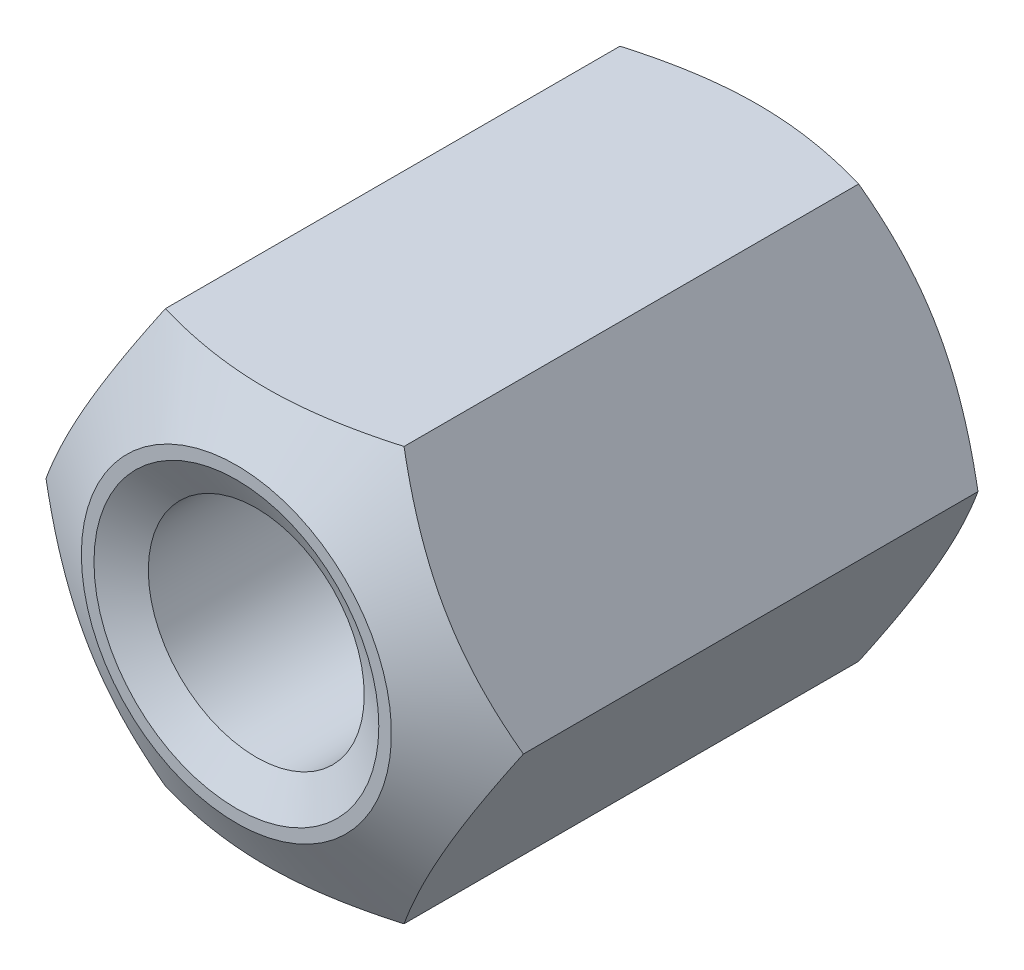
ISO-10303-21;
HEADER;
FILE_DESCRIPTION(('STEP AP214'),'2;1');
FILE_NAME('part.step','',(''),(''),'','','');
FILE_SCHEMA(('AUTOMOTIVE_DESIGN { 1 0 10303 214 1 1 1 1 }'));
ENDSEC;
DATA;
#1=APPLICATION_CONTEXT('core data for automotive mechanical design processes');
#2=APPLICATION_PROTOCOL_DEFINITION('international standard','automotive_design',2000,#1);
#3=PRODUCT_CONTEXT('',#1,'mechanical');
#4=PRODUCT('Part','Part','',(#3));
#5=PRODUCT_RELATED_PRODUCT_CATEGORY('part','',(#4));
#6=PRODUCT_DEFINITION_FORMATION('','',#4);
#7=PRODUCT_DEFINITION_CONTEXT('part definition',#1,'design');
#8=PRODUCT_DEFINITION('design','',#6,#7);
#9=PRODUCT_DEFINITION_SHAPE('','',#8);
#10=(LENGTH_UNIT() NAMED_UNIT(*) SI_UNIT(.MILLI.,.METRE.));
#11=(NAMED_UNIT(*) PLANE_ANGLE_UNIT() SI_UNIT($,.RADIAN.));
#12=(NAMED_UNIT(*) SI_UNIT($,.STERADIAN.) SOLID_ANGLE_UNIT());
#13=UNCERTAINTY_MEASURE_WITH_UNIT(LENGTH_MEASURE(1.E-05),#10,'distance_accuracy_value','');
#14=(GEOMETRIC_REPRESENTATION_CONTEXT(3) GLOBAL_UNCERTAINTY_ASSIGNED_CONTEXT((#13)) GLOBAL_UNIT_ASSIGNED_CONTEXT((#10,
#11,#12)) REPRESENTATION_CONTEXT('',''));
#15=CARTESIAN_POINT('',(0.,0.,0.));
#16=DIRECTION('',(0.,0.,1.));
#17=DIRECTION('',(1.,0.,0.));
#18=AXIS2_PLACEMENT_3D('',#15,#16,#17);
#19=CARTESIAN_POINT('',(-0.866025403784436,-1.5,-4.));
#20=DIRECTION('',(0.,-1.,0.));
#21=DIRECTION('',(0.,0.,-1.));
#22=AXIS2_PLACEMENT_3D('',#19,#20,#21);
#23=PLANE('',#22);
#24=CARTESIAN_POINT('',(-2.26693345301521,-1.5,-0.919874384172642));
#25=CARTESIAN_POINT('',(-2.20188303273797,-1.5,-0.888562452462311));
#26=CARTESIAN_POINT('',(-2.13667684988253,-1.5,-0.857568569031008));
#27=CARTESIAN_POINT('',(-2.00586953022165,-1.5,-0.7963969093381));
#28=CARTESIAN_POINT('',(-1.94026832716272,-1.5,-0.766219274919815));
#29=CARTESIAN_POINT('',(-1.80822017956272,-1.5,-0.706695365326242));
#30=CARTESIAN_POINT('',(-1.74177052725006,-1.5,-0.677355070587742));
#31=CARTESIAN_POINT('',(-1.60832240242563,-1.5,-0.619958278975157));
#32=CARTESIAN_POINT('',(-1.54132395796637,-1.5,-0.591901716957623));
#33=CARTESIAN_POINT('',(-1.40476495340522,-1.5,-0.536640444134464));
#34=CARTESIAN_POINT('',(-1.33518540573023,-1.5,-0.509482035692131));
#35=CARTESIAN_POINT('',(-1.19520545200329,-1.5,-0.457377612613115));
#36=CARTESIAN_POINT('',(-1.1248049448955,-1.5,-0.432431873667728));
#37=CARTESIAN_POINT('',(-0.912475099879092,-1.5,-0.361941641392045));
#38=CARTESIAN_POINT('',(-0.769037948715545,-1.5,-0.32058351367642));
#39=CARTESIAN_POINT('',(-0.55117522790169,-1.5,-0.272320238838825));
#40=CARTESIAN_POINT('',(-0.478279688505808,-1.5,-0.258544668352086));
#41=CARTESIAN_POINT('',(-0.331643668736196,-1.5,-0.236479268966357));
#42=CARTESIAN_POINT('',(-0.257903250213881,-1.5,-0.228189041077221));
#43=CARTESIAN_POINT('',(-0.110885806995904,-1.5,-0.217861610132535));
#44=CARTESIAN_POINT('',(-0.0376142381396591,-1.5,-0.215748751807276));
#45=CARTESIAN_POINT('',(0.108840678925693,-1.5,-0.217752050691236));
#46=CARTESIAN_POINT('',(0.182024023057309,-1.5,-0.221868485528129));
#47=CARTESIAN_POINT('',(0.361283721333757,-1.5,-0.239217704292242));
#48=CARTESIAN_POINT('',(0.467039999376319,-1.5,-0.255767579870401));
#49=CARTESIAN_POINT('',(0.676513016249369,-1.5,-0.298813596634206));
#50=CARTESIAN_POINT('',(0.78022748407577,-1.5,-0.325320219634023));
#51=CARTESIAN_POINT('',(0.987747554950468,-1.5,-0.386092023869418));
#52=CARTESIAN_POINT('',(1.09150632260099,-1.5,-0.420513046538082));
#53=CARTESIAN_POINT('',(1.29711320820291,-1.5,-0.494457523924006));
#54=CARTESIAN_POINT('',(1.39896195446643,-1.5,-0.533979265773226));
#55=CARTESIAN_POINT('',(1.63268883721878,-1.5,-0.629393113847812));
#56=CARTESIAN_POINT('',(1.76404499844625,-1.5,-0.686551305017162));
#57=CARTESIAN_POINT('',(2.02503341818732,-1.5,-0.804698224256575));
#58=CARTESIAN_POINT('',(2.15466528292228,-1.5,-0.865687809704643));
#59=CARTESIAN_POINT('',(2.41281157832431,-1.5,-0.990261928905305));
#60=CARTESIAN_POINT('',(2.54132491927922,-1.5,-1.05384871003748));
#61=CARTESIAN_POINT('',(2.7974698083102,-1.5,-1.18277574092178));
#62=CARTESIAN_POINT('',(2.92510133041389,-1.5,-1.24811604204618));
#63=CARTESIAN_POINT('',(3.16960929365729,-1.5,-1.37481289046744));
#64=CARTESIAN_POINT('',(3.28653531165753,-1.5,-1.43607399275226));
#65=CARTESIAN_POINT('',(3.51996707335722,-1.5,-1.55939892213538));
#66=CARTESIAN_POINT('',(3.63647280463813,-1.5,-1.62146277270864));
#67=CARTESIAN_POINT('',(3.86890456937834,-1.5,-1.7460713661942));
#68=CARTESIAN_POINT('',(3.98483131033979,-1.5,-1.8086147911346));
#69=CARTESIAN_POINT('',(4.21641481057912,-1.5,-1.93418664618929));
#70=CARTESIAN_POINT('',(4.33207158240369,-1.5,-1.99721505315485));
#71=CARTESIAN_POINT('',(4.44762816953721,-1.5,-2.06042537060534));
#72=B_SPLINE_CURVE_WITH_KNOTS('',3,(#24,#25,#26,#27,#28,#29,#30,#31,#32,#33,#34,#35,#36,#37,#38,
#39,#40,#41,#42,#43,#44,#45,#46,#47,#48,#49,#50,#51,#52,#53,#54,#55,#56,#57,#58,#59,#60,#61,#62,
#63,#64,#65,#66,#67,#68,#69,#70,#71),.UNSPECIFIED.,.F.,.F.,(4,2,2,2,2,2,2,2,2,2,2,2,2,2,2,2,2,2,
2,2,2,2,2,4),(0.,0.216585078480729,0.433207555234763,0.651112650745326,0.86900667629712,
1.09304248962346,1.31710617797398,1.7639991691894,1.98639046187009,2.20876557658381,
2.42840557690672,2.64805536645234,2.96852202366,3.2893269970795,3.61709161422759,
3.9447464500269,4.37440217676969,4.80415439546756,5.23428670622766,5.6644316322128,
6.0604347438135,6.45644946212125,6.85161425159961,7.24676029499814),.UNSPECIFIED.);
#73=CARTESIAN_POINT('',(-0.866025403784437,-1.5,-0.350480947161665));
#74=VERTEX_POINT('',#73);
#75=CARTESIAN_POINT('',(0.866025403784439,-1.5,-0.350480947161665));
#76=VERTEX_POINT('',#75);
#77=EDGE_CURVE('E49',#74,#76,#72,.T.);
#78=ORIENTED_EDGE('',*,*,#77,.F.);
#79=DIRECTION('',(0.,0.,1.));
#80=VECTOR('',#79,1.);
#81=CARTESIAN_POINT('',(-0.866025403784436,-1.5,-4.));
#82=LINE('',#81,#80);
#83=CARTESIAN_POINT('',(-0.866025403784436,-1.5,-3.64951905283833));
#84=VERTEX_POINT('',#83);
#85=EDGE_CURVE('E104',#84,#74,#82,.T.);
#86=ORIENTED_EDGE('',*,*,#85,.F.);
#87=CARTESIAN_POINT('',(-2.26693345301521,-1.5,-3.08012561582736));
#88=CARTESIAN_POINT('',(-2.20188303273797,-1.5,-3.11143754753769));
#89=CARTESIAN_POINT('',(-2.13667684988253,-1.5,-3.14243143096899));
#90=CARTESIAN_POINT('',(-2.00586953022165,-1.5,-3.2036030906619));
#91=CARTESIAN_POINT('',(-1.94026832716272,-1.5,-3.23378072508018));
#92=CARTESIAN_POINT('',(-1.80822017956272,-1.5,-3.29330463467376));
#93=CARTESIAN_POINT('',(-1.74177052725006,-1.5,-3.32264492941226));
#94=CARTESIAN_POINT('',(-1.60832240242563,-1.5,-3.38004172102484));
#95=CARTESIAN_POINT('',(-1.54132395796637,-1.5,-3.40809828304238));
#96=CARTESIAN_POINT('',(-1.40476495340522,-1.5,-3.46335955586554));
#97=CARTESIAN_POINT('',(-1.33518540573023,-1.5,-3.49051796430787));
#98=CARTESIAN_POINT('',(-1.19520545200329,-1.5,-3.54262238738688));
#99=CARTESIAN_POINT('',(-1.1248049448955,-1.5,-3.56756812633227));
#100=CARTESIAN_POINT('',(-0.912475099879092,-1.5,-3.63805835860795));
#101=CARTESIAN_POINT('',(-0.769037948715546,-1.5,-3.67941648632358));
#102=CARTESIAN_POINT('',(-0.55117522790169,-1.5,-3.72767976116117));
#103=CARTESIAN_POINT('',(-0.478279688505808,-1.5,-3.74145533164791));
#104=CARTESIAN_POINT('',(-0.331643668736196,-1.5,-3.76352073103364));
#105=CARTESIAN_POINT('',(-0.257903250213881,-1.5,-3.77181095892278));
#106=CARTESIAN_POINT('',(-0.110885806995904,-1.5,-3.78213838986746));
#107=CARTESIAN_POINT('',(-0.0376142381396587,-1.5,-3.78425124819272));
#108=CARTESIAN_POINT('',(0.108840678925693,-1.5,-3.78224794930876));
#109=CARTESIAN_POINT('',(0.18202402305731,-1.5,-3.77813151447187));
#110=CARTESIAN_POINT('',(0.361283721333757,-1.5,-3.76078229570776));
#111=CARTESIAN_POINT('',(0.467039999376319,-1.5,-3.7442324201296));
#112=CARTESIAN_POINT('',(0.676513016249368,-1.5,-3.70118640336579));
#113=CARTESIAN_POINT('',(0.780227484075769,-1.5,-3.67467978036598));
#114=CARTESIAN_POINT('',(0.987747554950466,-1.5,-3.61390797613058));
#115=CARTESIAN_POINT('',(1.09150632260098,-1.5,-3.57948695346192));
#116=CARTESIAN_POINT('',(1.29711320820291,-1.5,-3.50554247607599));
#117=CARTESIAN_POINT('',(1.39896195446643,-1.5,-3.46602073422677));
#118=CARTESIAN_POINT('',(1.63268883721878,-1.5,-3.37060688615219));
#119=CARTESIAN_POINT('',(1.76404499844625,-1.5,-3.31344869498284));
#120=CARTESIAN_POINT('',(2.02503341818732,-1.5,-3.19530177574342));
#121=CARTESIAN_POINT('',(2.15466528292228,-1.5,-3.13431219029536));
#122=CARTESIAN_POINT('',(2.4128115783243,-1.5,-3.00973807109469));
#123=CARTESIAN_POINT('',(2.54132491927921,-1.5,-2.94615128996252));
#124=CARTESIAN_POINT('',(2.7974698083102,-1.5,-2.81722425907822));
#125=CARTESIAN_POINT('',(2.92510133041389,-1.5,-2.75188395795381));
#126=CARTESIAN_POINT('',(3.16960929365729,-1.5,-2.62518710953255));
#127=CARTESIAN_POINT('',(3.28653531165753,-1.5,-2.56392600724774));
#128=CARTESIAN_POINT('',(3.51996707335722,-1.5,-2.44060107786461));
#129=CARTESIAN_POINT('',(3.63647280463813,-1.5,-2.37853722729136));
#130=CARTESIAN_POINT('',(3.86890456937834,-1.5,-2.25392863380579));
#131=CARTESIAN_POINT('',(3.98483131033979,-1.5,-2.1913852088654));
#132=CARTESIAN_POINT('',(4.21641481057912,-1.5,-2.06581335381071));
#133=CARTESIAN_POINT('',(4.33207158240368,-1.5,-2.00278494684515));
#134=CARTESIAN_POINT('',(4.44762816953721,-1.5,-1.93957462939465));
#135=B_SPLINE_CURVE_WITH_KNOTS('',3,(#87,#88,#89,#90,#91,#92,#93,#94,#95,#96,#97,#98,#99,#100,
#101,#102,#103,#104,#105,#106,#107,#108,#109,#110,#111,#112,#113,#114,#115,#116,#117,#118,#119,
#120,#121,#122,#123,#124,#125,#126,#127,#128,#129,#130,#131,#132,#133,#134),.UNSPECIFIED.,.F.,
.F.,(4,2,2,2,2,2,2,2,2,2,2,2,2,2,2,2,2,2,2,2,2,2,2,4),(0.,0.216585078480729,0.433207555234763,
0.651112650745326,0.86900667629712,1.09304248962346,1.31710617797398,1.7639991691894,
1.98639046187009,2.20876557658381,2.42840557690672,2.64805536645234,2.96852202366,
3.2893269970795,3.61709161422759,3.94474645002689,4.37440217676969,4.80415439546756,
5.23428670622766,5.6644316322128,6.0604347438135,6.45644946212125,6.85161425159961,
7.24676029499814),.UNSPECIFIED.);
#136=CARTESIAN_POINT('',(0.86602540378444,-1.5,-3.64951905283833));
#137=VERTEX_POINT('',#136);
#138=EDGE_CURVE('E125',#137,#84,#135,.F.);
#139=ORIENTED_EDGE('',*,*,#138,.F.);
#140=DIRECTION('',(0.,0.,1.));
#141=VECTOR('',#140,1.);
#142=CARTESIAN_POINT('',(0.866025403784439,-1.5,-4.));
#143=LINE('',#142,#141);
#144=EDGE_CURVE('E122',#137,#76,#143,.T.);
#145=ORIENTED_EDGE('',*,*,#144,.T.);
#146=EDGE_LOOP('',(#78,#86,#139,#145));
#147=FACE_BOUND('',#146,.T.);
#148=ADVANCED_FACE('F34',(#147),#23,.T.);
#149=CARTESIAN_POINT('',(-1.73205080756888,0.,-4.));
#150=DIRECTION('',(-0.866025403784438,-0.5,0.));
#151=DIRECTION('',(0.5,-0.866025403784438,0.));
#152=AXIS2_PLACEMENT_3D('',#149,#150,#151);
#153=PLANE('',#152);
#154=CARTESIAN_POINT('',(-1.73216627762271,0.000199999999999783,-0.350547620494554));
#155=CARTESIAN_POINT('',(-1.69410775715987,-0.0657192911025477,-0.328563803715282));
#156=CARTESIAN_POINT('',(-1.65572072040024,-0.132207589122235,-0.308569836627927));
#157=CARTESIAN_POINT('',(-1.5782818421891,-0.26633566066507,-0.273669048130612));
#158=CARTESIAN_POINT('',(-1.53922862406973,-0.333977818646886,-0.258774575269272));
#159=CARTESIAN_POINT('',(-1.4616062133209,-0.468423777869842,-0.235587628256349));
#160=CARTESIAN_POINT('',(-1.42304896848399,-0.535206884927247,-0.22714085865792));
#161=CARTESIAN_POINT('',(-1.34575291984755,-0.669087568389879,-0.217054524457959));
#162=CARTESIAN_POINT('',(-1.30701439726998,-0.736184657704377,-0.215406610303996));
#163=CARTESIAN_POINT('',(-1.23462040422031,-0.861574731829194,-0.21882256999921));
#164=CARTESIAN_POINT('',(-1.20095413349903,-0.919886423219818,-0.223047706170086));
#165=CARTESIAN_POINT('',(-1.13384094270175,-1.03612987953878,-0.236442722378777));
#166=CARTESIAN_POINT('',(-1.10039425500826,-1.09406124196878,-0.245617184561953));
#167=CARTESIAN_POINT('',(-1.03314252725215,-1.21054465133915,-0.2685541309011));
#168=CARTESIAN_POINT('',(-0.999346005261149,-1.26908194454669,-0.282413909107551));
#169=CARTESIAN_POINT('',(-0.932257223377915,-1.38528312338636,-0.31387073118276));
#170=CARTESIAN_POINT('',(-0.898964103011319,-1.44294849940381,-0.331460376835719));
#171=CARTESIAN_POINT('',(-0.865909933730598,-1.5002,-0.350547620494554));
#172=B_SPLINE_CURVE_WITH_KNOTS('',3,(#154,#155,#156,#157,#158,#159,#160,#161,#162,#163,#164,
#165,#166,#167,#168,#169,#170,#171),.UNSPECIFIED.,.F.,.F.,(4,2,2,2,2,2,2,2,4),(0.,
0.237777822177383,0.476127422841918,0.708577067230589,0.940741159251578,1.1429435283589,
1.34533342091875,1.55221450553907,1.75868901573748),.UNSPECIFIED.);
#173=CARTESIAN_POINT('',(-1.73205080756888,0.,-0.350480947161665));
#174=VERTEX_POINT('',#173);
#175=EDGE_CURVE('E89',#174,#74,#172,.T.);
#176=ORIENTED_EDGE('',*,*,#175,.F.);
#177=DIRECTION('',(0.,0.,1.));
#178=VECTOR('',#177,1.);
#179=CARTESIAN_POINT('',(-1.73205080756888,0.,-4.));
#180=LINE('',#179,#178);
#181=CARTESIAN_POINT('',(-1.73205080756888,0.,-3.64951905283833));
#182=VERTEX_POINT('',#181);
#183=EDGE_CURVE('E102',#182,#174,#180,.T.);
#184=ORIENTED_EDGE('',*,*,#183,.F.);
#185=CARTESIAN_POINT('',(-0.865909933730598,-1.5002,-3.64945237950545));
#186=CARTESIAN_POINT('',(-0.903968454193444,-1.43428070889745,-3.67143619628472));
#187=CARTESIAN_POINT('',(-0.94235549095307,-1.36779241087777,-3.69143016337207));
#188=CARTESIAN_POINT('',(-1.01979436916421,-1.23366433933493,-3.72633095186939));
#189=CARTESIAN_POINT('',(-1.05884758728358,-1.16602218135312,-3.74122542473073));
#190=CARTESIAN_POINT('',(-1.13646999803241,-1.03157622213016,-3.76441237174365));
#191=CARTESIAN_POINT('',(-1.17502724286932,-0.964793115072754,-3.77285914134208));
#192=CARTESIAN_POINT('',(-1.25232329150577,-0.830912431610121,-3.78294547554204));
#193=CARTESIAN_POINT('',(-1.29106181408333,-0.763815342295623,-3.784593389696));
#194=CARTESIAN_POINT('',(-1.363455807133,-0.638425268170806,-3.78117743000079));
#195=CARTESIAN_POINT('',(-1.39712207785428,-0.580113576780182,-3.77695229382991));
#196=CARTESIAN_POINT('',(-1.46423526865157,-0.463870120461219,-3.76355727762122));
#197=CARTESIAN_POINT('',(-1.49768195634505,-0.405938758031215,-3.75438281543805));
#198=CARTESIAN_POINT('',(-1.56493368410116,-0.289455348660849,-3.7314458690989));
#199=CARTESIAN_POINT('',(-1.59873020609216,-0.230918055453309,-3.71758609089245));
#200=CARTESIAN_POINT('',(-1.6658189879754,-0.114716876613641,-3.68612926881724));
#201=CARTESIAN_POINT('',(-1.69911210834199,-0.0570515005961898,-3.66853962316428));
#202=CARTESIAN_POINT('',(-1.73216627762271,0.000199999999999768,-3.64945237950545));
#203=B_SPLINE_CURVE_WITH_KNOTS('',3,(#185,#186,#187,#188,#189,#190,#191,#192,#193,#194,#195,
#196,#197,#198,#199,#200,#201,#202),.UNSPECIFIED.,.F.,.F.,(4,2,2,2,2,2,2,2,4),(0.,
0.237777822177383,0.476127422841918,0.708577067230588,0.940741159251578,1.1429435283589,
1.34533342091875,1.55221450553907,1.75868901573748),.UNSPECIFIED.);
#204=EDGE_CURVE('E198',#84,#182,#203,.T.);
#205=ORIENTED_EDGE('',*,*,#204,.F.);
#206=ORIENTED_EDGE('',*,*,#85,.T.);
#207=EDGE_LOOP('',(#176,#184,#205,#206));
#208=FACE_BOUND('',#207,.T.);
#209=ADVANCED_FACE('F100',(#208),#153,.T.);
#210=CARTESIAN_POINT('',(-0.866025403784437,1.5,-4.));
#211=DIRECTION('',(-0.866025403784439,0.5,0.));
#212=DIRECTION('',(-0.5,-0.866025403784439,0.));
#213=AXIS2_PLACEMENT_3D('',#210,#211,#212);
#214=PLANE('',#213);
#215=CARTESIAN_POINT('',(-0.865909933730599,1.5002,-0.350547620494554));
#216=CARTESIAN_POINT('',(-0.903968454193444,1.43428070889745,-0.328563803715282));
#217=CARTESIAN_POINT('',(-0.942355490953071,1.36779241087777,-0.308569836627927));
#218=CARTESIAN_POINT('',(-1.01979436916421,1.23366433933493,-0.273669048130612));
#219=CARTESIAN_POINT('',(-1.05884758728358,1.16602218135311,-0.258774575269272));
#220=CARTESIAN_POINT('',(-1.13646999803241,1.03157622213016,-0.235587628256349));
#221=CARTESIAN_POINT('',(-1.17502724286932,0.964793115072754,-0.22714085865792));
#222=CARTESIAN_POINT('',(-1.25232329150577,0.830912431610121,-0.217054524457959));
#223=CARTESIAN_POINT('',(-1.29106181408333,0.763815342295623,-0.215406610303997));
#224=CARTESIAN_POINT('',(-1.363455807133,0.638425268170806,-0.21882256999921));
#225=CARTESIAN_POINT('',(-1.39712207785428,0.580113576780182,-0.223047706170086));
#226=CARTESIAN_POINT('',(-1.46423526865157,0.463870120461218,-0.236442722378776));
#227=CARTESIAN_POINT('',(-1.49768195634505,0.405938758031215,-0.245617184561953));
#228=CARTESIAN_POINT('',(-1.56493368410116,0.289455348660848,-0.268554130901099));
#229=CARTESIAN_POINT('',(-1.59873020609216,0.230918055453308,-0.282413909107551));
#230=CARTESIAN_POINT('',(-1.6658189879754,0.11471687661364,-0.31387073118276));
#231=CARTESIAN_POINT('',(-1.69911210834199,0.0570515005961893,-0.331460376835719));
#232=CARTESIAN_POINT('',(-1.73216627762271,-0.000200000000000195,-0.350547620494554));
#233=B_SPLINE_CURVE_WITH_KNOTS('',3,(#215,#216,#217,#218,#219,#220,#221,#222,#223,#224,#225,
#226,#227,#228,#229,#230,#231,#232),.UNSPECIFIED.,.F.,.F.,(4,2,2,2,2,2,2,2,4),(0.,
0.237777822177383,0.476127422841918,0.708577067230588,0.940741159251578,1.1429435283589,
1.34533342091875,1.55221450553907,1.75868901573748),.UNSPECIFIED.);
#234=CARTESIAN_POINT('',(-0.866025403784436,1.5,-0.350480947161665));
#235=VERTEX_POINT('',#234);
#236=EDGE_CURVE('E85',#235,#174,#233,.T.);
#237=ORIENTED_EDGE('',*,*,#236,.F.);
#238=DIRECTION('',(0.,0.,1.));
#239=VECTOR('',#238,1.);
#240=CARTESIAN_POINT('',(-0.866025403784437,1.5,-4.));
#241=LINE('',#240,#239);
#242=CARTESIAN_POINT('',(-0.866025403784437,1.5,-3.64951905283833));
#243=VERTEX_POINT('',#242);
#244=EDGE_CURVE('E109',#243,#235,#241,.T.);
#245=ORIENTED_EDGE('',*,*,#244,.F.);
#246=CARTESIAN_POINT('',(-1.73216627762271,-0.000200000000000183,-3.64945237950545));
#247=CARTESIAN_POINT('',(-1.69410775715987,0.0657192911025475,-3.67143619628472));
#248=CARTESIAN_POINT('',(-1.65572072040024,0.132207589122235,-3.69143016337207));
#249=CARTESIAN_POINT('',(-1.5782818421891,0.26633566066507,-3.72633095186939));
#250=CARTESIAN_POINT('',(-1.53922862406973,0.333977818646885,-3.74122542473073));
#251=CARTESIAN_POINT('',(-1.4616062133209,0.468423777869842,-3.76441237174365));
#252=CARTESIAN_POINT('',(-1.42304896848399,0.535206884927247,-3.77285914134208));
#253=CARTESIAN_POINT('',(-1.34575291984755,0.669087568389879,-3.78294547554204));
#254=CARTESIAN_POINT('',(-1.30701439726998,0.736184657704377,-3.784593389696));
#255=CARTESIAN_POINT('',(-1.23462040422031,0.861574731829194,-3.78117743000079));
#256=CARTESIAN_POINT('',(-1.20095413349903,0.919886423219818,-3.77695229382991));
#257=CARTESIAN_POINT('',(-1.13384094270175,1.03612987953878,-3.76355727762122));
#258=CARTESIAN_POINT('',(-1.10039425500826,1.09406124196878,-3.75438281543805));
#259=CARTESIAN_POINT('',(-1.03314252725215,1.21054465133915,-3.7314458690989));
#260=CARTESIAN_POINT('',(-0.999346005261149,1.26908194454669,-3.71758609089245));
#261=CARTESIAN_POINT('',(-0.932257223377915,1.38528312338636,-3.68612926881724));
#262=CARTESIAN_POINT('',(-0.898964103011319,1.44294849940381,-3.66853962316428));
#263=CARTESIAN_POINT('',(-0.865909933730599,1.5002,-3.64945237950544));
#264=B_SPLINE_CURVE_WITH_KNOTS('',3,(#246,#247,#248,#249,#250,#251,#252,#253,#254,#255,#256,
#257,#258,#259,#260,#261,#262,#263),.UNSPECIFIED.,.F.,.F.,(4,2,2,2,2,2,2,2,4),(0.,
0.237777822177383,0.476127422841918,0.708577067230589,0.940741159251579,1.1429435283589,
1.34533342091875,1.55221450553907,1.75868901573748),.UNSPECIFIED.);
#265=EDGE_CURVE('E108',#182,#243,#264,.T.);
#266=ORIENTED_EDGE('',*,*,#265,.F.);
#267=ORIENTED_EDGE('',*,*,#183,.T.);
#268=EDGE_LOOP('',(#237,#245,#266,#267));
#269=FACE_BOUND('',#268,.T.);
#270=ADVANCED_FACE('F107',(#269),#214,.T.);
#271=CARTESIAN_POINT('',(0.866025403784436,1.5,-4.));
#272=DIRECTION('',(0.,1.,0.));
#273=DIRECTION('',(0.,0.,1.));
#274=AXIS2_PLACEMENT_3D('',#271,#272,#273);
#275=PLANE('',#274);
#276=CARTESIAN_POINT('',(-2.26693345301521,1.5,-0.919874384172643));
#277=CARTESIAN_POINT('',(-2.20188303273797,1.5,-0.888562452462311));
#278=CARTESIAN_POINT('',(-2.13667684988253,1.5,-0.857568569031009));
#279=CARTESIAN_POINT('',(-2.00586953022165,1.5,-0.796396909338101));
#280=CARTESIAN_POINT('',(-1.94026832716272,1.5,-0.766219274919816));
#281=CARTESIAN_POINT('',(-1.80822017956272,1.5,-0.706695365326243));
#282=CARTESIAN_POINT('',(-1.74177052725006,1.5,-0.677355070587743));
#283=CARTESIAN_POINT('',(-1.60832240242563,1.5,-0.619958278975157));
#284=CARTESIAN_POINT('',(-1.54132395796637,1.5,-0.591901716957623));
#285=CARTESIAN_POINT('',(-1.40476495340522,1.5,-0.536640444134464));
#286=CARTESIAN_POINT('',(-1.33518540573023,1.5,-0.509482035692132));
#287=CARTESIAN_POINT('',(-1.19520545200329,1.5,-0.457377612613116));
#288=CARTESIAN_POINT('',(-1.1248049448955,1.5,-0.432431873667728));
#289=CARTESIAN_POINT('',(-0.912475099879093,1.5,-0.361941641392045));
#290=CARTESIAN_POINT('',(-0.769037948715546,1.5,-0.32058351367642));
#291=CARTESIAN_POINT('',(-0.551175227901691,1.5,-0.272320238838825));
#292=CARTESIAN_POINT('',(-0.478279688505808,1.5,-0.258544668352086));
#293=CARTESIAN_POINT('',(-0.331643668736196,1.5,-0.236479268966357));
#294=CARTESIAN_POINT('',(-0.257903250213882,1.5,-0.228189041077221));
#295=CARTESIAN_POINT('',(-0.110885806995904,1.5,-0.217861610132536));
#296=CARTESIAN_POINT('',(-0.0376142381396597,1.5,-0.215748751807276));
#297=CARTESIAN_POINT('',(0.108840678925692,1.5,-0.217752050691236));
#298=CARTESIAN_POINT('',(0.182024023057309,1.5,-0.221868485528129));
#299=CARTESIAN_POINT('',(0.361283721333757,1.5,-0.239217704292242));
#300=CARTESIAN_POINT('',(0.467039999376318,1.5,-0.255767579870401));
#301=CARTESIAN_POINT('',(0.676513016249368,1.5,-0.298813596634206));
#302=CARTESIAN_POINT('',(0.78022748407577,1.5,-0.325320219634023));
#303=CARTESIAN_POINT('',(0.987747554950467,1.5,-0.386092023869418));
#304=CARTESIAN_POINT('',(1.09150632260099,1.5,-0.420513046538082));
#305=CARTESIAN_POINT('',(1.29711320820291,1.5,-0.494457523924006));
#306=CARTESIAN_POINT('',(1.39896195446643,1.5,-0.533979265773226));
#307=CARTESIAN_POINT('',(1.63268883721878,1.5,-0.629393113847812));
#308=CARTESIAN_POINT('',(1.76404499844625,1.5,-0.686551305017161));
#309=CARTESIAN_POINT('',(2.02503341818732,1.5,-0.804698224256575));
#310=CARTESIAN_POINT('',(2.15466528292228,1.5,-0.865687809704643));
#311=CARTESIAN_POINT('',(2.4128115783243,1.5,-0.990261928905305));
#312=CARTESIAN_POINT('',(2.54132491927921,1.5,-1.05384871003748));
#313=CARTESIAN_POINT('',(2.7974698083102,1.5,-1.18277574092178));
#314=CARTESIAN_POINT('',(2.92510133041389,1.5,-1.24811604204618));
#315=CARTESIAN_POINT('',(3.16960929365729,1.5,-1.37481289046744));
#316=CARTESIAN_POINT('',(3.28653531165753,1.5,-1.43607399275226));
#317=CARTESIAN_POINT('',(3.51996707335721,1.5,-1.55939892213538));
#318=CARTESIAN_POINT('',(3.63647280463813,1.5,-1.62146277270864));
#319=CARTESIAN_POINT('',(3.86890456937834,1.5,-1.7460713661942));
#320=CARTESIAN_POINT('',(3.98483131033979,1.5,-1.8086147911346));
#321=CARTESIAN_POINT('',(4.21641481057912,1.5,-1.93418664618929));
#322=CARTESIAN_POINT('',(4.33207158240368,1.5,-1.99721505315484));
#323=CARTESIAN_POINT('',(4.4476281695372,1.5,-2.06042537060534));
#324=B_SPLINE_CURVE_WITH_KNOTS('',3,(#276,#277,#278,#279,#280,#281,#282,#283,#284,#285,#286,
#287,#288,#289,#290,#291,#292,#293,#294,#295,#296,#297,#298,#299,#300,#301,#302,#303,#304,#305,
#306,#307,#308,#309,#310,#311,#312,#313,#314,#315,#316,#317,#318,#319,#320,#321,#322,#323),
.UNSPECIFIED.,.F.,.F.,(4,2,2,2,2,2,2,2,2,2,2,2,2,2,2,2,2,2,2,2,2,2,2,4),(0.,0.21658507848073,
0.433207555234763,0.651112650745326,0.869006676297121,1.09304248962346,1.31710617797398,
1.7639991691894,1.98639046187009,2.20876557658381,2.42840557690672,2.64805536645234,
2.96852202366,3.28932699707951,3.61709161422759,3.9447464500269,4.37440217676969,
4.80415439546756,5.23428670622766,5.6644316322128,6.0604347438135,6.45644946212125,
6.8516142515996,7.24676029499813),.UNSPECIFIED.);
#325=CARTESIAN_POINT('',(0.866025403784434,1.5,-0.350480947161665));
#326=VERTEX_POINT('',#325);
#327=EDGE_CURVE('E91',#326,#235,#324,.F.);
#328=ORIENTED_EDGE('',*,*,#327,.F.);
#329=DIRECTION('',(0.,0.,1.));
#330=VECTOR('',#329,1.);
#331=CARTESIAN_POINT('',(0.866025403784436,1.5,-4.));
#332=LINE('',#331,#330);
#333=CARTESIAN_POINT('',(0.866025403784435,1.5,-3.64951905283833));
#334=VERTEX_POINT('',#333);
#335=EDGE_CURVE('E113',#334,#326,#332,.T.);
#336=ORIENTED_EDGE('',*,*,#335,.F.);
#337=CARTESIAN_POINT('',(-2.26693345301521,1.5,-3.08012561582736));
#338=CARTESIAN_POINT('',(-2.20188303273797,1.5,-3.11143754753769));
#339=CARTESIAN_POINT('',(-2.13667684988253,1.5,-3.14243143096899));
#340=CARTESIAN_POINT('',(-2.00586953022165,1.5,-3.2036030906619));
#341=CARTESIAN_POINT('',(-1.94026832716272,1.5,-3.23378072508018));
#342=CARTESIAN_POINT('',(-1.80822017956273,1.5,-3.29330463467376));
#343=CARTESIAN_POINT('',(-1.74177052725006,1.5,-3.32264492941226));
#344=CARTESIAN_POINT('',(-1.60832240242563,1.5,-3.38004172102484));
#345=CARTESIAN_POINT('',(-1.54132395796637,1.5,-3.40809828304238));
#346=CARTESIAN_POINT('',(-1.40476495340522,1.5,-3.46335955586553));
#347=CARTESIAN_POINT('',(-1.33518540573023,1.5,-3.49051796430787));
#348=CARTESIAN_POINT('',(-1.19520545200329,1.5,-3.54262238738688));
#349=CARTESIAN_POINT('',(-1.1248049448955,1.5,-3.56756812633227));
#350=CARTESIAN_POINT('',(-0.912475099879094,1.5,-3.63805835860795));
#351=CARTESIAN_POINT('',(-0.769037948715547,1.5,-3.67941648632358));
#352=CARTESIAN_POINT('',(-0.551175227901691,1.5,-3.72767976116117));
#353=CARTESIAN_POINT('',(-0.478279688505809,1.5,-3.74145533164791));
#354=CARTESIAN_POINT('',(-0.331643668736197,1.5,-3.76352073103364));
#355=CARTESIAN_POINT('',(-0.257903250213882,1.5,-3.77181095892278));
#356=CARTESIAN_POINT('',(-0.110885806995904,1.5,-3.78213838986746));
#357=CARTESIAN_POINT('',(-0.0376142381396594,1.5,-3.78425124819272));
#358=CARTESIAN_POINT('',(0.108840678925692,1.5,-3.78224794930876));
#359=CARTESIAN_POINT('',(0.182024023057309,1.5,-3.77813151447187));
#360=CARTESIAN_POINT('',(0.361283721333757,1.5,-3.76078229570776));
#361=CARTESIAN_POINT('',(0.467039999376318,1.5,-3.7442324201296));
#362=CARTESIAN_POINT('',(0.676513016249368,1.5,-3.70118640336579));
#363=CARTESIAN_POINT('',(0.780227484075768,1.5,-3.67467978036598));
#364=CARTESIAN_POINT('',(0.987747554950466,1.5,-3.61390797613058));
#365=CARTESIAN_POINT('',(1.09150632260098,1.5,-3.57948695346192));
#366=CARTESIAN_POINT('',(1.29711320820291,1.5,-3.50554247607599));
#367=CARTESIAN_POINT('',(1.39896195446643,1.5,-3.46602073422677));
#368=CARTESIAN_POINT('',(1.63268883721878,1.5,-3.37060688615219));
#369=CARTESIAN_POINT('',(1.76404499844624,1.5,-3.31344869498284));
#370=CARTESIAN_POINT('',(2.02503341818731,1.5,-3.19530177574342));
#371=CARTESIAN_POINT('',(2.15466528292228,1.5,-3.13431219029536));
#372=CARTESIAN_POINT('',(2.4128115783243,1.5,-3.00973807109469));
#373=CARTESIAN_POINT('',(2.54132491927921,1.5,-2.94615128996252));
#374=CARTESIAN_POINT('',(2.7974698083102,1.5,-2.81722425907822));
#375=CARTESIAN_POINT('',(2.92510133041389,1.5,-2.75188395795382));
#376=CARTESIAN_POINT('',(3.16960929365729,1.5,-2.62518710953256));
#377=CARTESIAN_POINT('',(3.28653531165752,1.5,-2.56392600724774));
#378=CARTESIAN_POINT('',(3.51996707335721,1.5,-2.44060107786461));
#379=CARTESIAN_POINT('',(3.63647280463813,1.5,-2.37853722729136));
#380=CARTESIAN_POINT('',(3.86890456937834,1.5,-2.2539286338058));
#381=CARTESIAN_POINT('',(3.98483131033978,1.5,-2.1913852088654));
#382=CARTESIAN_POINT('',(4.21641481057912,1.5,-2.06581335381071));
#383=CARTESIAN_POINT('',(4.33207158240368,1.5,-2.00278494684515));
#384=CARTESIAN_POINT('',(4.4476281695372,1.5,-1.93957462939466));
#385=B_SPLINE_CURVE_WITH_KNOTS('',3,(#337,#338,#339,#340,#341,#342,#343,#344,#345,#346,#347,
#348,#349,#350,#351,#352,#353,#354,#355,#356,#357,#358,#359,#360,#361,#362,#363,#364,#365,#366,
#367,#368,#369,#370,#371,#372,#373,#374,#375,#376,#377,#378,#379,#380,#381,#382,#383,#384),
.UNSPECIFIED.,.F.,.F.,(4,2,2,2,2,2,2,2,2,2,2,2,2,2,2,2,2,2,2,2,2,2,2,4),(0.,0.216585078480729,
0.433207555234762,0.651112650745325,0.86900667629712,1.09304248962346,1.31710617797398,
1.7639991691894,1.98639046187009,2.20876557658381,2.42840557690672,2.64805536645234,
2.96852202366,3.2893269970795,3.61709161422759,3.9447464500269,4.37440217676969,
4.80415439546756,5.23428670622766,5.6644316322128,6.0604347438135,6.45644946212125,
6.8516142515996,7.24676029499813),.UNSPECIFIED.);
#386=EDGE_CURVE('E185',#243,#334,#385,.T.);
#387=ORIENTED_EDGE('',*,*,#386,.F.);
#388=ORIENTED_EDGE('',*,*,#244,.T.);
#389=EDGE_LOOP('',(#328,#336,#387,#388));
#390=FACE_BOUND('',#389,.T.);
#391=ADVANCED_FACE('F233',(#390),#275,.T.);
#392=CARTESIAN_POINT('',(1.73205080756888,0.,-4.));
#393=DIRECTION('',(0.866025403784438,0.500000000000001,0.));
#394=DIRECTION('',(-0.500000000000001,0.866025403784438,0.));
#395=AXIS2_PLACEMENT_3D('',#392,#393,#394);
#396=PLANE('',#395);
#397=CARTESIAN_POINT('',(1.73216627762271,-0.00020000000000174,-0.350547620494553));
#398=CARTESIAN_POINT('',(1.69410775715987,0.0657192911025458,-0.328563803715282));
#399=CARTESIAN_POINT('',(1.65572072040024,0.132207589122233,-0.308569836627926));
#400=CARTESIAN_POINT('',(1.5782818421891,0.266335660665068,-0.273669048130611));
#401=CARTESIAN_POINT('',(1.53922862406973,0.333977818646883,-0.258774575269271));
#402=CARTESIAN_POINT('',(1.4616062133209,0.46842377786984,-0.235587628256348));
#403=CARTESIAN_POINT('',(1.42304896848399,0.535206884927245,-0.227140858657919));
#404=CARTESIAN_POINT('',(1.34575291984755,0.669087568389877,-0.217054524457958));
#405=CARTESIAN_POINT('',(1.30701439726998,0.736184657704375,-0.215406610303995));
#406=CARTESIAN_POINT('',(1.23462040422031,0.861574731829192,-0.218822569999209));
#407=CARTESIAN_POINT('',(1.20095413349903,0.919886423219816,-0.223047706170084));
#408=CARTESIAN_POINT('',(1.13384094270175,1.03612987953878,-0.236442722378775));
#409=CARTESIAN_POINT('',(1.10039425500826,1.09406124196878,-0.245617184561952));
#410=CARTESIAN_POINT('',(1.03314252725215,1.21054465133915,-0.268554130901098));
#411=CARTESIAN_POINT('',(0.999346005261149,1.26908194454669,-0.28241390910755));
#412=CARTESIAN_POINT('',(0.932257223377915,1.38528312338636,-0.313870731182759));
#413=CARTESIAN_POINT('',(0.898964103011318,1.44294849940381,-0.331460376835718));
#414=CARTESIAN_POINT('',(0.865909933730598,1.5002,-0.350547620494553));
#415=B_SPLINE_CURVE_WITH_KNOTS('',3,(#397,#398,#399,#400,#401,#402,#403,#404,#405,#406,#407,
#408,#409,#410,#411,#412,#413,#414),.UNSPECIFIED.,.F.,.F.,(4,2,2,2,2,2,2,2,4),(0.,
0.237777822177383,0.476127422841917,0.708577067230588,0.940741159251578,1.1429435283589,
1.34533342091876,1.55221450553907,1.75868901573748),.UNSPECIFIED.);
#416=CARTESIAN_POINT('',(1.73205080756888,0.,-0.350480947161665));
#417=VERTEX_POINT('',#416);
#418=EDGE_CURVE('E227',#417,#326,#415,.T.);
#419=ORIENTED_EDGE('',*,*,#418,.F.);
#420=DIRECTION('',(0.,0.,1.));
#421=VECTOR('',#420,1.);
#422=CARTESIAN_POINT('',(1.73205080756888,0.,-4.));
#423=LINE('',#422,#421);
#424=CARTESIAN_POINT('',(1.73205080756888,0.,-3.64951905283833));
#425=VERTEX_POINT('',#424);
#426=EDGE_CURVE('E119',#425,#417,#423,.T.);
#427=ORIENTED_EDGE('',*,*,#426,.F.);
#428=CARTESIAN_POINT('',(0.865909933730598,1.5002,-3.64945237950545));
#429=CARTESIAN_POINT('',(0.903968454193443,1.43428070889745,-3.67143619628472));
#430=CARTESIAN_POINT('',(0.942355490953069,1.36779241087777,-3.69143016337207));
#431=CARTESIAN_POINT('',(1.01979436916421,1.23366433933493,-3.72633095186939));
#432=CARTESIAN_POINT('',(1.05884758728358,1.16602218135312,-3.74122542473073));
#433=CARTESIAN_POINT('',(1.13646999803241,1.03157622213016,-3.76441237174365));
#434=CARTESIAN_POINT('',(1.17502724286932,0.964793115072754,-3.77285914134208));
#435=CARTESIAN_POINT('',(1.25232329150576,0.830912431610122,-3.78294547554204));
#436=CARTESIAN_POINT('',(1.29106181408333,0.763815342295624,-3.784593389696));
#437=CARTESIAN_POINT('',(1.363455807133,0.638425268170807,-3.78117743000079));
#438=CARTESIAN_POINT('',(1.39712207785428,0.580113576780182,-3.77695229382992));
#439=CARTESIAN_POINT('',(1.46423526865157,0.463870120461218,-3.76355727762122));
#440=CARTESIAN_POINT('',(1.49768195634505,0.405938758031215,-3.75438281543805));
#441=CARTESIAN_POINT('',(1.56493368410116,0.289455348660848,-3.7314458690989));
#442=CARTESIAN_POINT('',(1.59873020609216,0.230918055453308,-3.71758609089245));
#443=CARTESIAN_POINT('',(1.6658189879754,0.114716876613639,-3.68612926881724));
#444=CARTESIAN_POINT('',(1.69911210834199,0.057051500596188,-3.66853962316428));
#445=CARTESIAN_POINT('',(1.73216627762271,-0.000200000000001701,-3.64945237950545));
#446=B_SPLINE_CURVE_WITH_KNOTS('',3,(#428,#429,#430,#431,#432,#433,#434,#435,#436,#437,#438,
#439,#440,#441,#442,#443,#444,#445),.UNSPECIFIED.,.F.,.F.,(4,2,2,2,2,2,2,2,4),(0.,
0.237777822177383,0.476127422841917,0.708577067230588,0.940741159251578,1.1429435283589,
1.34533342091876,1.55221450553907,1.75868901573748),.UNSPECIFIED.);
#447=EDGE_CURVE('E57',#334,#425,#446,.T.);
#448=ORIENTED_EDGE('',*,*,#447,.F.);
#449=ORIENTED_EDGE('',*,*,#335,.T.);
#450=EDGE_LOOP('',(#419,#427,#448,#449));
#451=FACE_BOUND('',#450,.T.);
#452=ADVANCED_FACE('F236',(#451),#396,.T.);
#453=CARTESIAN_POINT('',(0.866025403784439,-1.5,-4.));
#454=DIRECTION('',(0.866025403784439,-0.5,0.));
#455=DIRECTION('',(0.5,0.866025403784439,0.));
#456=AXIS2_PLACEMENT_3D('',#453,#454,#455);
#457=PLANE('',#456);
#458=CARTESIAN_POINT('',(0.865909933730602,-1.5002,-0.350547620494555));
#459=CARTESIAN_POINT('',(0.903968454193447,-1.43428070889745,-0.328563803715283));
#460=CARTESIAN_POINT('',(0.942355490953073,-1.36779241087777,-0.308569836627927));
#461=CARTESIAN_POINT('',(1.01979436916421,-1.23366433933493,-0.273669048130612));
#462=CARTESIAN_POINT('',(1.05884758728358,-1.16602218135311,-0.258774575269272));
#463=CARTESIAN_POINT('',(1.13646999803241,-1.03157622213016,-0.235587628256349));
#464=CARTESIAN_POINT('',(1.17502724286933,-0.964793115072753,-0.22714085865792));
#465=CARTESIAN_POINT('',(1.25232329150577,-0.830912431610121,-0.217054524457959));
#466=CARTESIAN_POINT('',(1.29106181408333,-0.763815342295623,-0.215406610303997));
#467=CARTESIAN_POINT('',(1.363455807133,-0.638425268170806,-0.21882256999921));
#468=CARTESIAN_POINT('',(1.39712207785428,-0.580113576780182,-0.223047706170086));
#469=CARTESIAN_POINT('',(1.46423526865157,-0.463870120461219,-0.236442722378777));
#470=CARTESIAN_POINT('',(1.49768195634505,-0.405938758031216,-0.245617184561953));
#471=CARTESIAN_POINT('',(1.56493368410116,-0.289455348660849,-0.268554130901099));
#472=CARTESIAN_POINT('',(1.59873020609216,-0.23091805545331,-0.28241390910755));
#473=CARTESIAN_POINT('',(1.6658189879754,-0.114716876613642,-0.313870731182759));
#474=CARTESIAN_POINT('',(1.69911210834199,-0.0570515005961912,-0.331460376835718));
#475=CARTESIAN_POINT('',(1.73216627762271,0.00019999999999815,-0.350547620494553));
#476=B_SPLINE_CURVE_WITH_KNOTS('',3,(#458,#459,#460,#461,#462,#463,#464,#465,#466,#467,#468,
#469,#470,#471,#472,#473,#474,#475),.UNSPECIFIED.,.F.,.F.,(4,2,2,2,2,2,2,2,4),(0.,
0.237777822177383,0.476127422841918,0.708577067230589,0.940741159251579,1.1429435283589,
1.34533342091875,1.55221450553907,1.75868901573748),.UNSPECIFIED.);
#477=EDGE_CURVE('E257',#76,#417,#476,.T.);
#478=ORIENTED_EDGE('',*,*,#477,.F.);
#479=ORIENTED_EDGE('',*,*,#144,.F.);
#480=CARTESIAN_POINT('',(1.73216627762271,0.000199999999998212,-3.64945237950545));
#481=CARTESIAN_POINT('',(1.69410775715987,-0.0657192911025495,-3.67143619628472));
#482=CARTESIAN_POINT('',(1.65572072040024,-0.132207589122237,-3.69143016337207));
#483=CARTESIAN_POINT('',(1.5782818421891,-0.266335660665072,-3.72633095186939));
#484=CARTESIAN_POINT('',(1.53922862406973,-0.333977818646887,-3.74122542473073));
#485=CARTESIAN_POINT('',(1.4616062133209,-0.468423777869844,-3.76441237174365));
#486=CARTESIAN_POINT('',(1.42304896848399,-0.535206884927249,-3.77285914134208));
#487=CARTESIAN_POINT('',(1.34575291984755,-0.669087568389881,-3.78294547554204));
#488=CARTESIAN_POINT('',(1.30701439726998,-0.736184657704379,-3.784593389696));
#489=CARTESIAN_POINT('',(1.23462040422031,-0.861574731829196,-3.78117743000079));
#490=CARTESIAN_POINT('',(1.20095413349903,-0.91988642321982,-3.77695229382991));
#491=CARTESIAN_POINT('',(1.13384094270175,-1.03612987953878,-3.76355727762122));
#492=CARTESIAN_POINT('',(1.10039425500826,-1.09406124196879,-3.75438281543805));
#493=CARTESIAN_POINT('',(1.03314252725216,-1.21054465133915,-3.7314458690989));
#494=CARTESIAN_POINT('',(0.999346005261152,-1.26908194454669,-3.71758609089245));
#495=CARTESIAN_POINT('',(0.932257223377917,-1.38528312338636,-3.68612926881724));
#496=CARTESIAN_POINT('',(0.898964103011321,-1.44294849940381,-3.66853962316428));
#497=CARTESIAN_POINT('',(0.865909933730601,-1.5002,-3.64945237950544));
#498=B_SPLINE_CURVE_WITH_KNOTS('',3,(#480,#481,#482,#483,#484,#485,#486,#487,#488,#489,#490,
#491,#492,#493,#494,#495,#496,#497),.UNSPECIFIED.,.F.,.F.,(4,2,2,2,2,2,2,2,4),(0.,
0.237777822177383,0.476127422841918,0.708577067230588,0.940741159251578,1.1429435283589,
1.34533342091875,1.55221450553907,1.75868901573748),.UNSPECIFIED.);
#499=EDGE_CURVE('E151',#425,#137,#498,.T.);
#500=ORIENTED_EDGE('',*,*,#499,.F.);
#501=ORIENTED_EDGE('',*,*,#426,.T.);
#502=EDGE_LOOP('',(#478,#479,#500,#501));
#503=FACE_BOUND('',#502,.T.);
#504=ADVANCED_FACE('F145',(#503),#457,.T.);
#505=CARTESIAN_POINT('',(0.866025403784439,-1.5,-4.));
#506=DIRECTION('',(0.,0.,1.));
#507=DIRECTION('',(1.,0.,0.));
#508=AXIS2_PLACEMENT_3D('',#505,#506,#507);
#509=PLANE('',#508);
#510=CARTESIAN_POINT('',(0.,0.,-4.));
#511=DIRECTION('',(0.,0.,1.));
#512=DIRECTION('',(1.,0.,0.));
#513=AXIS2_PLACEMENT_3D('',#510,#511,#512);
#514=CIRCLE('',#513,0.927837567297407);
#515=CARTESIAN_POINT('',(0.927837567297407,0.,-4.));
#516=VERTEX_POINT('',#515);
#517=EDGE_CURVE('E111',#516,#516,#514,.T.);
#518=ORIENTED_EDGE('',*,*,#517,.T.);
#519=EDGE_LOOP('',(#518));
#520=FACE_BOUND('',#519,.T.);
#521=CARTESIAN_POINT('',(0.,0.,-4.));
#522=DIRECTION('',(0.,0.,-1.));
#523=DIRECTION('',(-1.,0.,0.));
#524=AXIS2_PLACEMENT_3D('',#521,#522,#523);
#525=CIRCLE('',#524,1.125);
#526=CARTESIAN_POINT('',(-1.125,0.,-4.));
#527=VERTEX_POINT('',#526);
#528=EDGE_CURVE('E149',#527,#527,#525,.T.);
#529=ORIENTED_EDGE('',*,*,#528,.T.);
#530=EDGE_LOOP('',(#529));
#531=FACE_BOUND('',#530,.T.);
#532=ADVANCED_FACE('F141',(#520,#531),#509,.F.);
#533=CARTESIAN_POINT('',(0.866025403784439,-1.5,0.));
#534=DIRECTION('',(0.,0.,1.));
#535=DIRECTION('',(1.,0.,0.));
#536=AXIS2_PLACEMENT_3D('',#533,#534,#535);
#537=PLANE('',#536);
#538=CARTESIAN_POINT('',(0.,0.,0.));
#539=DIRECTION('',(0.,0.,1.));
#540=DIRECTION('',(1.,0.,0.));
#541=AXIS2_PLACEMENT_3D('',#538,#539,#540);
#542=CIRCLE('',#541,1.0335);
#543=CARTESIAN_POINT('',(1.0335,0.,0.));
#544=VERTEX_POINT('',#543);
#545=EDGE_CURVE('E11',#544,#544,#542,.F.);
#546=ORIENTED_EDGE('',*,*,#545,.T.);
#547=EDGE_LOOP('',(#546));
#548=FACE_BOUND('',#547,.T.);
#549=CARTESIAN_POINT('',(0.,0.,0.));
#550=DIRECTION('',(0.,0.,-1.));
#551=DIRECTION('',(-1.,0.,0.));
#552=AXIS2_PLACEMENT_3D('',#549,#550,#551);
#553=CIRCLE('',#552,1.125);
#554=CARTESIAN_POINT('',(-1.125,0.,0.));
#555=VERTEX_POINT('',#554);
#556=EDGE_CURVE('E258',#555,#555,#553,.T.);
#557=ORIENTED_EDGE('',*,*,#556,.F.);
#558=EDGE_LOOP('',(#557));
#559=FACE_BOUND('',#558,.T.);
#560=ADVANCED_FACE('F144',(#548,#559),#537,.T.);
#561=CARTESIAN_POINT('',(0.,0.,-4.));
#562=DIRECTION('',(0.,0.,1.));
#563=DIRECTION('',(1.,0.,0.));
#564=AXIS2_PLACEMENT_3D('',#561,#562,#563);
#565=CYLINDRICAL_SURFACE('',#564,0.7835);
#566=CARTESIAN_POINT('',(0.,0.,-3.75));
#567=DIRECTION('',(0.,0.,1.));
#568=DIRECTION('',(1.,0.,0.));
#569=AXIS2_PLACEMENT_3D('',#566,#567,#568);
#570=CIRCLE('',#569,0.7835);
#571=CARTESIAN_POINT('',(0.7835,0.,-3.75));
#572=VERTEX_POINT('',#571);
#573=EDGE_CURVE('E42',#572,#572,#570,.F.);
#574=ORIENTED_EDGE('',*,*,#573,.T.);
#575=EDGE_LOOP('',(#574));
#576=FACE_BOUND('',#575,.T.);
#577=CARTESIAN_POINT('',(0.,0.,-0.144337567297407));
#578=DIRECTION('',(0.,0.,1.));
#579=DIRECTION('',(1.,0.,0.));
#580=AXIS2_PLACEMENT_3D('',#577,#578,#579);
#581=CIRCLE('',#580,0.7835);
#582=CARTESIAN_POINT('',(0.7835,0.,-0.144337567297407));
#583=VERTEX_POINT('',#582);
#584=EDGE_CURVE('E128',#583,#583,#581,.T.);
#585=ORIENTED_EDGE('',*,*,#584,.T.);
#586=EDGE_LOOP('',(#585));
#587=FACE_BOUND('',#586,.T.);
#588=ADVANCED_FACE('F133',(#576,#587),#565,.F.);
#589=CARTESIAN_POINT('',(0.,0.,-3.64951905283833));
#590=DIRECTION('',(0.,0.,1.));
#591=DIRECTION('',(1.,0.,0.));
#592=AXIS2_PLACEMENT_3D('',#589,#590,#591);
#593=CONICAL_SURFACE('',#592,1.73205080756888,1.0471975511966);
#594=ORIENTED_EDGE('',*,*,#138,.T.);
#595=ORIENTED_EDGE('',*,*,#204,.T.);
#596=ORIENTED_EDGE('',*,*,#265,.T.);
#597=ORIENTED_EDGE('',*,*,#386,.T.);
#598=ORIENTED_EDGE('',*,*,#447,.T.);
#599=ORIENTED_EDGE('',*,*,#499,.T.);
#600=EDGE_LOOP('',(#594,#595,#596,#597,#598,#599));
#601=FACE_BOUND('',#600,.T.);
#602=ORIENTED_EDGE('',*,*,#528,.F.);
#603=EDGE_LOOP('',(#602));
#604=FACE_BOUND('',#603,.T.);
#605=ADVANCED_FACE('F175',(#601,#604),#593,.T.);
#606=CARTESIAN_POINT('',(0.,0.,0.));
#607=DIRECTION('',(0.,0.,-1.));
#608=DIRECTION('',(-1.,0.,0.));
#609=AXIS2_PLACEMENT_3D('',#606,#607,#608);
#610=CONICAL_SURFACE('',#609,1.125,1.0471975511966);
#611=ORIENTED_EDGE('',*,*,#77,.T.);
#612=ORIENTED_EDGE('',*,*,#477,.T.);
#613=ORIENTED_EDGE('',*,*,#418,.T.);
#614=ORIENTED_EDGE('',*,*,#327,.T.);
#615=ORIENTED_EDGE('',*,*,#236,.T.);
#616=ORIENTED_EDGE('',*,*,#175,.T.);
#617=EDGE_LOOP('',(#611,#612,#613,#614,#615,#616));
#618=FACE_BOUND('',#617,.T.);
#619=ORIENTED_EDGE('',*,*,#556,.T.);
#620=EDGE_LOOP('',(#619));
#621=FACE_BOUND('',#620,.T.);
#622=ADVANCED_FACE('F87',(#618,#621),#610,.T.);
#623=CARTESIAN_POINT('',(0.,0.,-4.));
#624=DIRECTION('',(0.,0.,-1.));
#625=DIRECTION('',(-1.,0.,0.));
#626=AXIS2_PLACEMENT_3D('',#623,#624,#625);
#627=CONICAL_SURFACE('',#626,0.927837567297407,0.523598775598298);
#628=ORIENTED_EDGE('',*,*,#573,.F.);
#629=EDGE_LOOP('',(#628));
#630=FACE_BOUND('',#629,.T.);
#631=ORIENTED_EDGE('',*,*,#517,.F.);
#632=EDGE_LOOP('',(#631));
#633=FACE_BOUND('',#632,.T.);
#634=ADVANCED_FACE('F136',(#630,#633),#627,.F.);
#635=CARTESIAN_POINT('',(0.,0.,-0.144337567297407));
#636=DIRECTION('',(0.,0.,1.));
#637=DIRECTION('',(1.,0.,0.));
#638=AXIS2_PLACEMENT_3D('',#635,#636,#637);
#639=CONICAL_SURFACE('',#638,0.7835,1.0471975511966);
#640=ORIENTED_EDGE('',*,*,#545,.F.);
#641=EDGE_LOOP('',(#640));
#642=FACE_BOUND('',#641,.T.);
#643=ORIENTED_EDGE('',*,*,#584,.F.);
#644=EDGE_LOOP('',(#643));
#645=FACE_BOUND('',#644,.T.);
#646=ADVANCED_FACE('F36',(#642,#645),#639,.F.);
#647=CLOSED_SHELL('',(#148,#209,#270,#391,#452,#504,#532,#560,#588,#605,#622,#634,#646));
#648=MANIFOLD_SOLID_BREP('B2',#647);
#649=ADVANCED_BREP_SHAPE_REPRESENTATION('',(#18,#648),#14);
#650=SHAPE_DEFINITION_REPRESENTATION(#9,#649);
ENDSEC;
END-ISO-10303-21;
